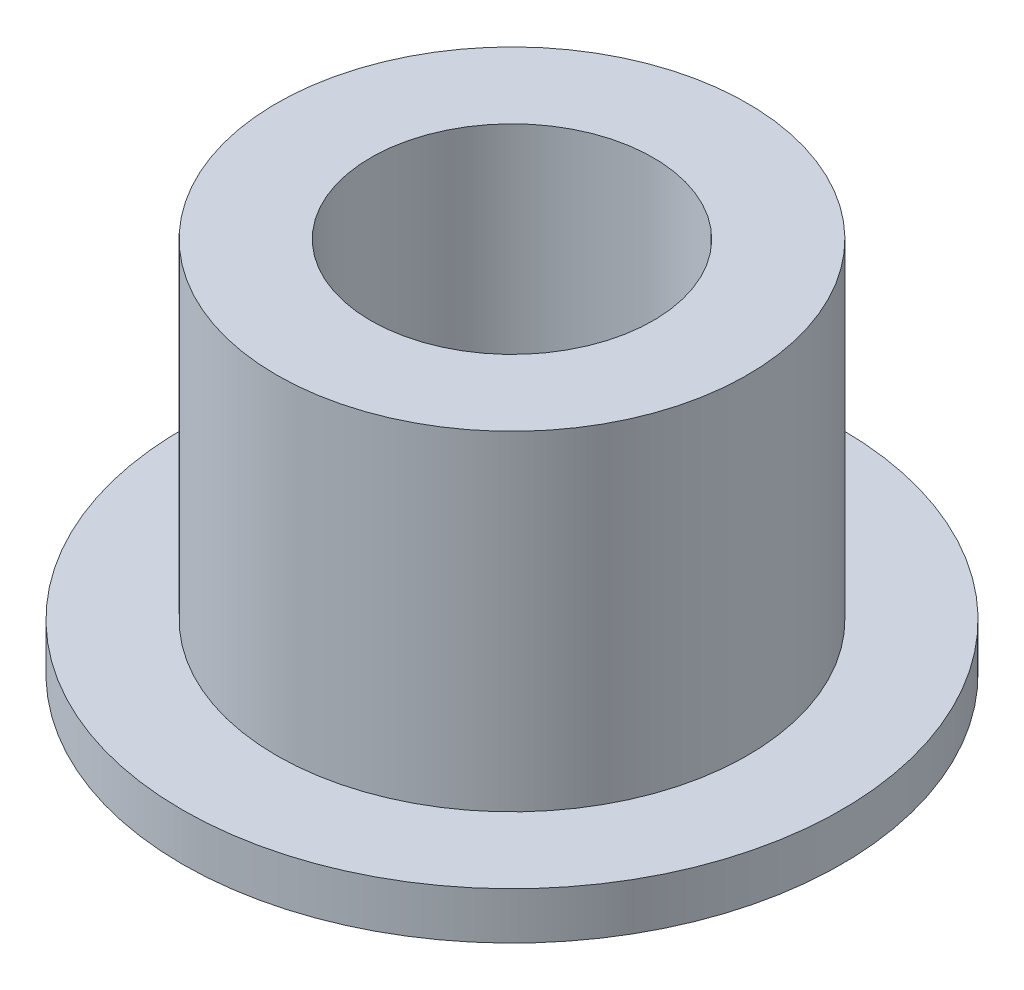
ISO-10303-21;
HEADER;
FILE_DESCRIPTION(('STEP AP214'),'2;1');
FILE_NAME('part.step','',(''),(''),'','','');
FILE_SCHEMA(('AUTOMOTIVE_DESIGN { 1 0 10303 214 1 1 1 1 }'));
ENDSEC;
DATA;
#1=APPLICATION_CONTEXT('core data for automotive mechanical design processes');
#2=APPLICATION_PROTOCOL_DEFINITION('international standard','automotive_design',2000,#1);
#3=PRODUCT_CONTEXT('',#1,'mechanical');
#4=PRODUCT('Part','Part','',(#3));
#5=PRODUCT_RELATED_PRODUCT_CATEGORY('part','',(#4));
#6=PRODUCT_DEFINITION_FORMATION('','',#4);
#7=PRODUCT_DEFINITION_CONTEXT('part definition',#1,'design');
#8=PRODUCT_DEFINITION('design','',#6,#7);
#9=PRODUCT_DEFINITION_SHAPE('','',#8);
#10=(LENGTH_UNIT() NAMED_UNIT(*) SI_UNIT(.MILLI.,.METRE.));
#11=(NAMED_UNIT(*) PLANE_ANGLE_UNIT() SI_UNIT($,.RADIAN.));
#12=(NAMED_UNIT(*) SI_UNIT($,.STERADIAN.) SOLID_ANGLE_UNIT());
#13=UNCERTAINTY_MEASURE_WITH_UNIT(LENGTH_MEASURE(1.E-05),#10,'distance_accuracy_value','');
#14=(GEOMETRIC_REPRESENTATION_CONTEXT(3) GLOBAL_UNCERTAINTY_ASSIGNED_CONTEXT((#13)) GLOBAL_UNIT_ASSIGNED_CONTEXT((#10,
#11,#12)) REPRESENTATION_CONTEXT('',''));
#15=CARTESIAN_POINT('',(0.,0.,0.));
#16=DIRECTION('',(0.,0.,1.));
#17=DIRECTION('',(1.,0.,0.));
#18=AXIS2_PLACEMENT_3D('',#15,#16,#17);
#19=CARTESIAN_POINT('',(0.,1.5875,0.));
#20=DIRECTION('',(0.,1.,0.));
#21=DIRECTION('',(0.,0.,1.));
#22=AXIS2_PLACEMENT_3D('',#19,#20,#21);
#23=PLANE('',#22);
#24=CARTESIAN_POINT('',(0.,1.5875,0.));
#25=DIRECTION('',(0.,1.,0.));
#26=DIRECTION('',(0.,0.,1.));
#27=AXIS2_PLACEMENT_3D('',#24,#25,#26);
#28=CIRCLE('',#27,11.1125);
#29=CARTESIAN_POINT('',(0.,1.5875,11.1125));
#30=VERTEX_POINT('',#29);
#31=EDGE_CURVE('E10',#30,#30,#28,.T.);
#32=ORIENTED_EDGE('',*,*,#31,.T.);
#33=EDGE_LOOP('',(#32));
#34=FACE_BOUND('',#33,.T.);
#35=CARTESIAN_POINT('',(0.,1.5875,0.));
#36=DIRECTION('',(0.,1.,0.));
#37=DIRECTION('',(0.,0.,1.));
#38=AXIS2_PLACEMENT_3D('',#35,#36,#37);
#39=CIRCLE('',#38,7.9375);
#40=CARTESIAN_POINT('',(0.,1.5875,7.9375));
#41=VERTEX_POINT('',#40);
#42=EDGE_CURVE('E46',#41,#41,#39,.T.);
#43=ORIENTED_EDGE('',*,*,#42,.F.);
#44=EDGE_LOOP('',(#43));
#45=FACE_BOUND('',#44,.T.);
#46=ADVANCED_FACE('F30',(#34,#45),#23,.T.);
#47=CARTESIAN_POINT('',(0.,0.,0.));
#48=DIRECTION('',(0.,1.,0.));
#49=DIRECTION('',(0.,0.,1.));
#50=AXIS2_PLACEMENT_3D('',#47,#48,#49);
#51=PLANE('',#50);
#52=CARTESIAN_POINT('',(0.,0.,0.));
#53=DIRECTION('',(0.,1.,0.));
#54=DIRECTION('',(0.,0.,1.));
#55=AXIS2_PLACEMENT_3D('',#52,#53,#54);
#56=CIRCLE('',#55,11.1125);
#57=CARTESIAN_POINT('',(0.,0.,11.1125));
#58=VERTEX_POINT('',#57);
#59=EDGE_CURVE('E34',#58,#58,#56,.T.);
#60=ORIENTED_EDGE('',*,*,#59,.F.);
#61=EDGE_LOOP('',(#60));
#62=FACE_BOUND('',#61,.T.);
#63=CARTESIAN_POINT('',(0.,0.,0.));
#64=DIRECTION('',(0.,1.,0.));
#65=DIRECTION('',(0.,0.,1.));
#66=AXIS2_PLACEMENT_3D('',#63,#64,#65);
#67=CIRCLE('',#66,4.7625);
#68=CARTESIAN_POINT('',(0.,0.,4.7625));
#69=VERTEX_POINT('',#68);
#70=EDGE_CURVE('E41',#69,#69,#67,.T.);
#71=ORIENTED_EDGE('',*,*,#70,.T.);
#72=EDGE_LOOP('',(#71));
#73=FACE_BOUND('',#72,.T.);
#74=ADVANCED_FACE('F71',(#62,#73),#51,.F.);
#75=CARTESIAN_POINT('',(0.,1.5875,0.));
#76=DIRECTION('',(0.,-1.,0.));
#77=DIRECTION('',(0.,0.,-1.));
#78=AXIS2_PLACEMENT_3D('',#75,#76,#77);
#79=CYLINDRICAL_SURFACE('',#78,11.1125);
#80=ORIENTED_EDGE('',*,*,#31,.F.);
#81=EDGE_LOOP('',(#80));
#82=FACE_BOUND('',#81,.T.);
#83=ORIENTED_EDGE('',*,*,#59,.T.);
#84=EDGE_LOOP('',(#83));
#85=FACE_BOUND('',#84,.T.);
#86=ADVANCED_FACE('F32',(#82,#85),#79,.T.);
#87=CARTESIAN_POINT('',(0.,1.5875,0.));
#88=DIRECTION('',(0.,-1.,0.));
#89=DIRECTION('',(0.,0.,-1.));
#90=AXIS2_PLACEMENT_3D('',#87,#88,#89);
#91=CYLINDRICAL_SURFACE('',#90,4.7625);
#92=ORIENTED_EDGE('',*,*,#70,.F.);
#93=EDGE_LOOP('',(#92));
#94=FACE_BOUND('',#93,.T.);
#95=CARTESIAN_POINT('',(0.,12.7,0.));
#96=DIRECTION('',(0.,1.,0.));
#97=DIRECTION('',(0.,0.,1.));
#98=AXIS2_PLACEMENT_3D('',#95,#96,#97);
#99=CIRCLE('',#98,4.7625);
#100=CARTESIAN_POINT('',(0.,12.7,4.7625));
#101=VERTEX_POINT('',#100);
#102=EDGE_CURVE('E49',#101,#101,#99,.T.);
#103=ORIENTED_EDGE('',*,*,#102,.T.);
#104=EDGE_LOOP('',(#103));
#105=FACE_BOUND('',#104,.T.);
#106=ADVANCED_FACE('F55',(#94,#105),#91,.F.);
#107=CARTESIAN_POINT('',(0.,12.7,0.));
#108=DIRECTION('',(0.,1.,0.));
#109=DIRECTION('',(0.,0.,1.));
#110=AXIS2_PLACEMENT_3D('',#107,#108,#109);
#111=PLANE('',#110);
#112=CARTESIAN_POINT('',(0.,12.7,0.));
#113=DIRECTION('',(0.,1.,0.));
#114=DIRECTION('',(0.,0.,1.));
#115=AXIS2_PLACEMENT_3D('',#112,#113,#114);
#116=CIRCLE('',#115,7.9375);
#117=CARTESIAN_POINT('',(0.,12.7,7.9375));
#118=VERTEX_POINT('',#117);
#119=EDGE_CURVE('E45',#118,#118,#116,.T.);
#120=ORIENTED_EDGE('',*,*,#119,.T.);
#121=EDGE_LOOP('',(#120));
#122=FACE_BOUND('',#121,.T.);
#123=ORIENTED_EDGE('',*,*,#102,.F.);
#124=EDGE_LOOP('',(#123));
#125=FACE_BOUND('',#124,.T.);
#126=ADVANCED_FACE('F57',(#122,#125),#111,.T.);
#127=CARTESIAN_POINT('',(0.,12.7,0.));
#128=DIRECTION('',(0.,-1.,0.));
#129=DIRECTION('',(0.,0.,-1.));
#130=AXIS2_PLACEMENT_3D('',#127,#128,#129);
#131=CYLINDRICAL_SURFACE('',#130,7.9375);
#132=ORIENTED_EDGE('',*,*,#119,.F.);
#133=EDGE_LOOP('',(#132));
#134=FACE_BOUND('',#133,.T.);
#135=ORIENTED_EDGE('',*,*,#42,.T.);
#136=EDGE_LOOP('',(#135));
#137=FACE_BOUND('',#136,.T.);
#138=ADVANCED_FACE('F59',(#134,#137),#131,.T.);
#139=CLOSED_SHELL('',(#46,#74,#86,#106,#126,#138));
#140=MANIFOLD_SOLID_BREP('B2',#139);
#141=ADVANCED_BREP_SHAPE_REPRESENTATION('',(#18,#140),#14);
#142=SHAPE_DEFINITION_REPRESENTATION(#9,#141);
ENDSEC;
END-ISO-10303-21;
